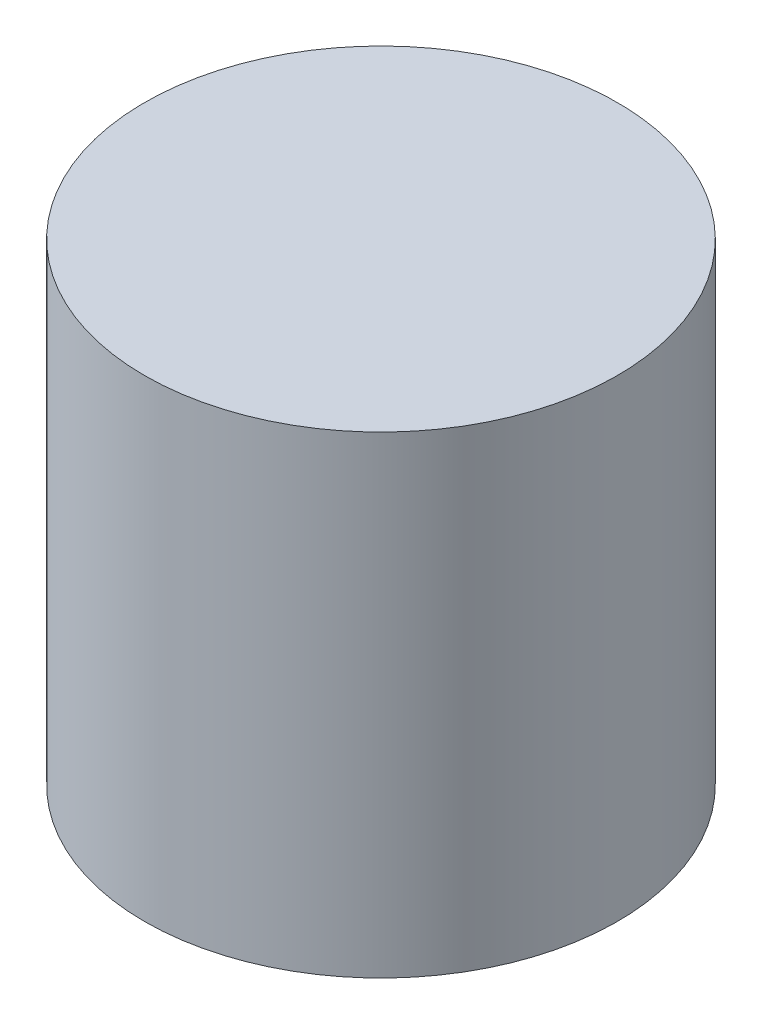
ISO-10303-21;
HEADER;
FILE_DESCRIPTION(('STEP AP214'),'2;1');
FILE_NAME('part.step','',(''),(''),'','','');
FILE_SCHEMA(('AUTOMOTIVE_DESIGN { 1 0 10303 214 1 1 1 1 }'));
ENDSEC;
DATA;
#1=APPLICATION_CONTEXT('core data for automotive mechanical design processes');
#2=APPLICATION_PROTOCOL_DEFINITION('international standard','automotive_design',2000,#1);
#3=PRODUCT_CONTEXT('',#1,'mechanical');
#4=PRODUCT('Part','Part','',(#3));
#5=PRODUCT_RELATED_PRODUCT_CATEGORY('part','',(#4));
#6=PRODUCT_DEFINITION_FORMATION('','',#4);
#7=PRODUCT_DEFINITION_CONTEXT('part definition',#1,'design');
#8=PRODUCT_DEFINITION('design','',#6,#7);
#9=PRODUCT_DEFINITION_SHAPE('','',#8);
#10=(LENGTH_UNIT() NAMED_UNIT(*) SI_UNIT(.MILLI.,.METRE.));
#11=(NAMED_UNIT(*) PLANE_ANGLE_UNIT() SI_UNIT($,.RADIAN.));
#12=(NAMED_UNIT(*) SI_UNIT($,.STERADIAN.) SOLID_ANGLE_UNIT());
#13=UNCERTAINTY_MEASURE_WITH_UNIT(LENGTH_MEASURE(1.E-05),#10,'distance_accuracy_value','');
#14=(GEOMETRIC_REPRESENTATION_CONTEXT(3) GLOBAL_UNCERTAINTY_ASSIGNED_CONTEXT((#13)) GLOBAL_UNIT_ASSIGNED_CONTEXT((#10,
#11,#12)) REPRESENTATION_CONTEXT('',''));
#15=CARTESIAN_POINT('',(0.,0.,0.));
#16=DIRECTION('',(0.,0.,1.));
#17=DIRECTION('',(1.,0.,0.));
#18=AXIS2_PLACEMENT_3D('',#15,#16,#17);
#19=CARTESIAN_POINT('',(0.,18.,0.));
#20=DIRECTION('',(0.,-1.,0.));
#21=DIRECTION('',(0.,0.,-1.));
#22=AXIS2_PLACEMENT_3D('',#19,#20,#21);
#23=CYLINDRICAL_SURFACE('',#22,9.);
#24=CARTESIAN_POINT('',(0.,18.,0.));
#25=DIRECTION('',(0.,1.,0.));
#26=DIRECTION('',(0.,0.,1.));
#27=AXIS2_PLACEMENT_3D('',#24,#25,#26);
#28=CIRCLE('',#27,9.);
#29=CARTESIAN_POINT('',(0.,18.,9.));
#30=VERTEX_POINT('',#29);
#31=EDGE_CURVE('E10',#30,#30,#28,.T.);
#32=ORIENTED_EDGE('',*,*,#31,.F.);
#33=EDGE_LOOP('',(#32));
#34=FACE_BOUND('',#33,.T.);
#35=CARTESIAN_POINT('',(0.,0.,0.));
#36=DIRECTION('',(0.,1.,0.));
#37=DIRECTION('',(0.,0.,1.));
#38=AXIS2_PLACEMENT_3D('',#35,#36,#37);
#39=CIRCLE('',#38,9.);
#40=CARTESIAN_POINT('',(0.,0.,9.));
#41=VERTEX_POINT('',#40);
#42=EDGE_CURVE('E35',#41,#41,#39,.T.);
#43=ORIENTED_EDGE('',*,*,#42,.T.);
#44=EDGE_LOOP('',(#43));
#45=FACE_BOUND('',#44,.T.);
#46=ADVANCED_FACE('F32',(#34,#45),#23,.T.);
#47=CARTESIAN_POINT('',(0.,18.,0.));
#48=DIRECTION('',(0.,1.,0.));
#49=DIRECTION('',(0.,0.,1.));
#50=AXIS2_PLACEMENT_3D('',#47,#48,#49);
#51=PLANE('',#50);
#52=ORIENTED_EDGE('',*,*,#31,.T.);
#53=EDGE_LOOP('',(#52));
#54=FACE_BOUND('',#53,.T.);
#55=ADVANCED_FACE('F47',(#54),#51,.T.);
#56=CARTESIAN_POINT('',(0.,0.,0.));
#57=DIRECTION('',(0.,1.,0.));
#58=DIRECTION('',(0.,0.,1.));
#59=AXIS2_PLACEMENT_3D('',#56,#57,#58);
#60=PLANE('',#59);
#61=ORIENTED_EDGE('',*,*,#42,.F.);
#62=EDGE_LOOP('',(#61));
#63=FACE_BOUND('',#62,.T.);
#64=ADVANCED_FACE('F45',(#63),#60,.F.);
#65=CLOSED_SHELL('',(#46,#55,#64));
#66=MANIFOLD_SOLID_BREP('B2',#65);
#67=ADVANCED_BREP_SHAPE_REPRESENTATION('',(#18,#66),#14);
#68=SHAPE_DEFINITION_REPRESENTATION(#9,#67);
ENDSEC;
END-ISO-10303-21;
